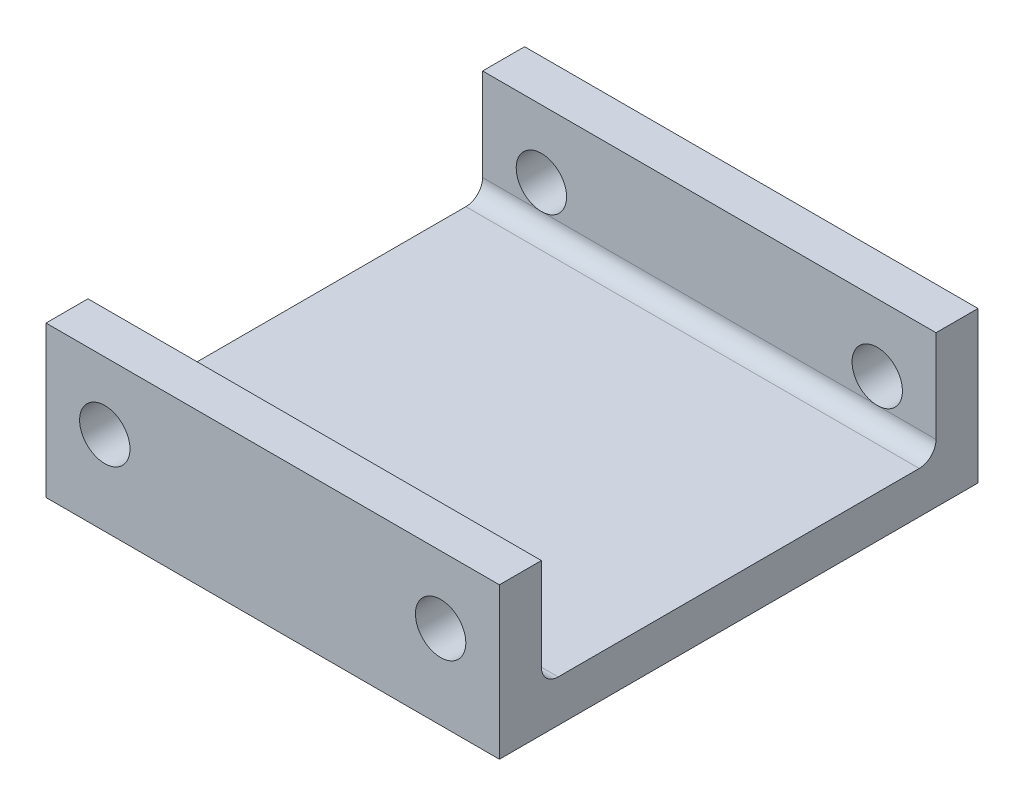
ISO-10303-21;
HEADER;
FILE_DESCRIPTION(('STEP AP214'),'2;1');
FILE_NAME('part.step','',(''),(''),'','','');
FILE_SCHEMA(('AUTOMOTIVE_DESIGN { 1 0 10303 214 1 1 1 1 }'));
ENDSEC;
DATA;
#1=APPLICATION_CONTEXT('core data for automotive mechanical design processes');
#2=APPLICATION_PROTOCOL_DEFINITION('international standard','automotive_design',2000,#1);
#3=PRODUCT_CONTEXT('',#1,'mechanical');
#4=PRODUCT('Part','Part','',(#3));
#5=PRODUCT_RELATED_PRODUCT_CATEGORY('part','',(#4));
#6=PRODUCT_DEFINITION_FORMATION('','',#4);
#7=PRODUCT_DEFINITION_CONTEXT('part definition',#1,'design');
#8=PRODUCT_DEFINITION('design','',#6,#7);
#9=PRODUCT_DEFINITION_SHAPE('','',#8);
#10=(LENGTH_UNIT() NAMED_UNIT(*) SI_UNIT(.MILLI.,.METRE.));
#11=(NAMED_UNIT(*) PLANE_ANGLE_UNIT() SI_UNIT($,.RADIAN.));
#12=(NAMED_UNIT(*) SI_UNIT($,.STERADIAN.) SOLID_ANGLE_UNIT());
#13=UNCERTAINTY_MEASURE_WITH_UNIT(LENGTH_MEASURE(1.E-05),#10,'distance_accuracy_value','');
#14=(GEOMETRIC_REPRESENTATION_CONTEXT(3) GLOBAL_UNCERTAINTY_ASSIGNED_CONTEXT((#13)) GLOBAL_UNIT_ASSIGNED_CONTEXT((#10,
#11,#12)) REPRESENTATION_CONTEXT('',''));
#15=CARTESIAN_POINT('',(0.,0.,0.));
#16=DIRECTION('',(0.,0.,1.));
#17=DIRECTION('',(1.,0.,0.));
#18=AXIS2_PLACEMENT_3D('',#15,#16,#17);
#19=CARTESIAN_POINT('',(-27.,0.,57.));
#20=DIRECTION('',(0.,-1.,0.));
#21=DIRECTION('',(0.,0.,-1.));
#22=AXIS2_PLACEMENT_3D('',#19,#20,#21);
#23=PLANE('',#22);
#24=DIRECTION('',(0.,0.,-1.));
#25=VECTOR('',#24,1.);
#26=CARTESIAN_POINT('',(-27.,0.,57.));
#27=LINE('',#26,#25);
#28=CARTESIAN_POINT('',(-27.,0.,5.));
#29=VERTEX_POINT('',#28);
#30=CARTESIAN_POINT('',(-27.,0.,0.));
#31=VERTEX_POINT('',#30);
#32=EDGE_CURVE('E150',#29,#31,#27,.T.);
#33=ORIENTED_EDGE('',*,*,#32,.F.);
#34=DIRECTION('',(-1.,0.,0.));
#35=VECTOR('',#34,1.);
#36=CARTESIAN_POINT('',(30.,0.,5.));
#37=LINE('',#36,#35);
#38=CARTESIAN_POINT('',(27.,0.,5.));
#39=VERTEX_POINT('',#38);
#40=EDGE_CURVE('E142',#39,#29,#37,.T.);
#41=ORIENTED_EDGE('',*,*,#40,.F.);
#42=DIRECTION('',(0.,0.,-1.));
#43=VECTOR('',#42,1.);
#44=CARTESIAN_POINT('',(27.,0.,57.));
#45=LINE('',#44,#43);
#46=CARTESIAN_POINT('',(27.,0.,0.));
#47=VERTEX_POINT('',#46);
#48=EDGE_CURVE('E149',#39,#47,#45,.T.);
#49=ORIENTED_EDGE('',*,*,#48,.T.);
#50=DIRECTION('',(-1.,0.,0.));
#51=VECTOR('',#50,1.);
#52=CARTESIAN_POINT('',(-27.,0.,0.));
#53=LINE('',#52,#51);
#54=EDGE_CURVE('E205',#47,#31,#53,.T.);
#55=ORIENTED_EDGE('',*,*,#54,.T.);
#56=EDGE_LOOP('',(#33,#41,#49,#55));
#57=FACE_BOUND('',#56,.T.);
#58=ADVANCED_FACE('F33',(#57),#23,.F.);
#59=CARTESIAN_POINT('',(-20.,-8.,57.));
#60=DIRECTION('',(0.,0.,-1.));
#61=DIRECTION('',(-1.,0.,0.));
#62=AXIS2_PLACEMENT_3D('',#59,#60,#61);
#63=CYLINDRICAL_SURFACE('',#62,2.99999999999999);
#64=CARTESIAN_POINT('',(-20.,-8.,5.));
#65=DIRECTION('',(0.,0.,-1.));
#66=DIRECTION('',(0.,1.,0.));
#67=AXIS2_PLACEMENT_3D('',#64,#65,#66);
#68=CIRCLE('',#67,2.99999999999999);
#69=CARTESIAN_POINT('',(-20.,-11.,5.));
#70=VERTEX_POINT('',#69);
#71=EDGE_CURVE('E373',#70,#70,#68,.T.);
#72=ORIENTED_EDGE('',*,*,#71,.F.);
#73=EDGE_LOOP('',(#72));
#74=FACE_BOUND('',#73,.T.);
#75=CARTESIAN_POINT('',(-20.,-8.,0.));
#76=DIRECTION('',(0.,0.,1.));
#77=DIRECTION('',(1.,0.,0.));
#78=AXIS2_PLACEMENT_3D('',#75,#76,#77);
#79=CIRCLE('',#78,2.99999999999999);
#80=CARTESIAN_POINT('',(-17.,-8.,0.));
#81=VERTEX_POINT('',#80);
#82=EDGE_CURVE('E176',#81,#81,#79,.T.);
#83=ORIENTED_EDGE('',*,*,#82,.F.);
#84=EDGE_LOOP('',(#83));
#85=FACE_BOUND('',#84,.T.);
#86=ADVANCED_FACE('F232',(#74,#85),#63,.F.);
#87=CARTESIAN_POINT('',(20.,-8.,57.));
#88=DIRECTION('',(0.,0.,-1.));
#89=DIRECTION('',(-1.,0.,0.));
#90=AXIS2_PLACEMENT_3D('',#87,#88,#89);
#91=CYLINDRICAL_SURFACE('',#90,2.99999999999999);
#92=CARTESIAN_POINT('',(20.,-8.,5.));
#93=DIRECTION('',(0.,0.,-1.));
#94=DIRECTION('',(0.,1.,0.));
#95=AXIS2_PLACEMENT_3D('',#92,#93,#94);
#96=CIRCLE('',#95,2.99999999999999);
#97=CARTESIAN_POINT('',(20.,-11.,5.));
#98=VERTEX_POINT('',#97);
#99=EDGE_CURVE('E11',#98,#98,#96,.T.);
#100=ORIENTED_EDGE('',*,*,#99,.F.);
#101=EDGE_LOOP('',(#100));
#102=FACE_BOUND('',#101,.T.);
#103=CARTESIAN_POINT('',(20.,-8.,0.));
#104=DIRECTION('',(0.,0.,1.));
#105=DIRECTION('',(1.,0.,0.));
#106=AXIS2_PLACEMENT_3D('',#103,#104,#105);
#107=CIRCLE('',#106,2.99999999999999);
#108=CARTESIAN_POINT('',(23.,-8.,0.));
#109=VERTEX_POINT('',#108);
#110=EDGE_CURVE('E177',#109,#109,#107,.T.);
#111=ORIENTED_EDGE('',*,*,#110,.F.);
#112=EDGE_LOOP('',(#111));
#113=FACE_BOUND('',#112,.T.);
#114=ADVANCED_FACE('F171',(#102,#113),#91,.F.);
#115=CARTESIAN_POINT('',(0.,0.,57.));
#116=DIRECTION('',(0.,0.,-1.));
#117=DIRECTION('',(-1.,0.,0.));
#118=AXIS2_PLACEMENT_3D('',#115,#116,#117);
#119=PLANE('',#118);
#120=DIRECTION('',(1.,0.,0.));
#121=VECTOR('',#120,1.);
#122=CARTESIAN_POINT('',(-27.,-18.,57.));
#123=LINE('',#122,#121);
#124=CARTESIAN_POINT('',(-27.,-18.,57.));
#125=VERTEX_POINT('',#124);
#126=CARTESIAN_POINT('',(27.,-18.,57.));
#127=VERTEX_POINT('',#126);
#128=EDGE_CURVE('E191',#125,#127,#123,.T.);
#129=ORIENTED_EDGE('',*,*,#128,.T.);
#130=DIRECTION('',(0.,1.,0.));
#131=VECTOR('',#130,1.);
#132=CARTESIAN_POINT('',(27.,0.,57.));
#133=LINE('',#132,#131);
#134=CARTESIAN_POINT('',(27.,0.,57.));
#135=VERTEX_POINT('',#134);
#136=EDGE_CURVE('E194',#127,#135,#133,.T.);
#137=ORIENTED_EDGE('',*,*,#136,.T.);
#138=DIRECTION('',(-1.,0.,0.));
#139=VECTOR('',#138,1.);
#140=CARTESIAN_POINT('',(-27.,0.,57.));
#141=LINE('',#140,#139);
#142=CARTESIAN_POINT('',(-27.,0.,57.));
#143=VERTEX_POINT('',#142);
#144=EDGE_CURVE('E197',#135,#143,#141,.T.);
#145=ORIENTED_EDGE('',*,*,#144,.T.);
#146=DIRECTION('',(0.,-1.,0.));
#147=VECTOR('',#146,1.);
#148=CARTESIAN_POINT('',(-27.,0.,57.));
#149=LINE('',#148,#147);
#150=EDGE_CURVE('E148',#143,#125,#149,.T.);
#151=ORIENTED_EDGE('',*,*,#150,.T.);
#152=EDGE_LOOP('',(#129,#137,#145,#151));
#153=FACE_BOUND('',#152,.T.);
#154=CARTESIAN_POINT('',(-20.,-8.,57.));
#155=DIRECTION('',(0.,0.,1.));
#156=DIRECTION('',(1.,0.,0.));
#157=AXIS2_PLACEMENT_3D('',#154,#155,#156);
#158=CIRCLE('',#157,2.99999999999999);
#159=CARTESIAN_POINT('',(-17.,-8.,57.));
#160=VERTEX_POINT('',#159);
#161=EDGE_CURVE('E180',#160,#160,#158,.T.);
#162=ORIENTED_EDGE('',*,*,#161,.F.);
#163=EDGE_LOOP('',(#162));
#164=FACE_BOUND('',#163,.T.);
#165=CARTESIAN_POINT('',(20.,-8.,57.));
#166=DIRECTION('',(0.,0.,1.));
#167=DIRECTION('',(1.,0.,0.));
#168=AXIS2_PLACEMENT_3D('',#165,#166,#167);
#169=CIRCLE('',#168,2.99999999999999);
#170=CARTESIAN_POINT('',(23.,-8.,57.));
#171=VERTEX_POINT('',#170);
#172=EDGE_CURVE('E174',#171,#171,#169,.T.);
#173=ORIENTED_EDGE('',*,*,#172,.F.);
#174=EDGE_LOOP('',(#173));
#175=FACE_BOUND('',#174,.T.);
#176=ADVANCED_FACE('F223',(#153,#164,#175),#119,.F.);
#177=CARTESIAN_POINT('',(0.,0.,0.));
#178=DIRECTION('',(0.,0.,-1.));
#179=DIRECTION('',(-1.,0.,0.));
#180=AXIS2_PLACEMENT_3D('',#177,#178,#179);
#181=PLANE('',#180);
#182=ORIENTED_EDGE('',*,*,#82,.T.);
#183=EDGE_LOOP('',(#182));
#184=FACE_BOUND('',#183,.T.);
#185=DIRECTION('',(1.,0.,0.));
#186=VECTOR('',#185,1.);
#187=CARTESIAN_POINT('',(-27.,-18.,0.));
#188=LINE('',#187,#186);
#189=CARTESIAN_POINT('',(-27.,-18.,0.));
#190=VERTEX_POINT('',#189);
#191=CARTESIAN_POINT('',(27.,-18.,0.));
#192=VERTEX_POINT('',#191);
#193=EDGE_CURVE('E189',#190,#192,#188,.T.);
#194=ORIENTED_EDGE('',*,*,#193,.F.);
#195=DIRECTION('',(0.,-1.,0.));
#196=VECTOR('',#195,1.);
#197=CARTESIAN_POINT('',(-27.,0.,0.));
#198=LINE('',#197,#196);
#199=EDGE_CURVE('E195',#31,#190,#198,.T.);
#200=ORIENTED_EDGE('',*,*,#199,.F.);
#201=ORIENTED_EDGE('',*,*,#54,.F.);
#202=DIRECTION('',(0.,1.,0.));
#203=VECTOR('',#202,1.);
#204=CARTESIAN_POINT('',(27.,0.,0.));
#205=LINE('',#204,#203);
#206=EDGE_CURVE('E202',#192,#47,#205,.T.);
#207=ORIENTED_EDGE('',*,*,#206,.F.);
#208=EDGE_LOOP('',(#194,#200,#201,#207));
#209=FACE_BOUND('',#208,.T.);
#210=ORIENTED_EDGE('',*,*,#110,.T.);
#211=EDGE_LOOP('',(#210));
#212=FACE_BOUND('',#211,.T.);
#213=ADVANCED_FACE('F217',(#184,#209,#212),#181,.T.);
#214=CARTESIAN_POINT('',(-27.,-18.,57.));
#215=DIRECTION('',(0.,1.,0.));
#216=DIRECTION('',(0.,0.,1.));
#217=AXIS2_PLACEMENT_3D('',#214,#215,#216);
#218=PLANE('',#217);
#219=ORIENTED_EDGE('',*,*,#193,.T.);
#220=DIRECTION('',(0.,0.,-1.));
#221=VECTOR('',#220,1.);
#222=CARTESIAN_POINT('',(27.,-18.,57.));
#223=LINE('',#222,#221);
#224=EDGE_CURVE('E157',#127,#192,#223,.T.);
#225=ORIENTED_EDGE('',*,*,#224,.F.);
#226=ORIENTED_EDGE('',*,*,#128,.F.);
#227=DIRECTION('',(0.,0.,-1.));
#228=VECTOR('',#227,1.);
#229=CARTESIAN_POINT('',(-27.,-18.,57.));
#230=LINE('',#229,#228);
#231=EDGE_CURVE('E153',#125,#190,#230,.T.);
#232=ORIENTED_EDGE('',*,*,#231,.T.);
#233=EDGE_LOOP('',(#219,#225,#226,#232));
#234=FACE_BOUND('',#233,.T.);
#235=ADVANCED_FACE('F35',(#234),#218,.F.);
#236=CARTESIAN_POINT('',(27.,0.,57.));
#237=DIRECTION('',(-1.,0.,0.));
#238=DIRECTION('',(0.,0.,1.));
#239=AXIS2_PLACEMENT_3D('',#236,#237,#238);
#240=PLANE('',#239);
#241=ORIENTED_EDGE('',*,*,#48,.F.);
#242=DIRECTION('',(0.,-1.,0.));
#243=VECTOR('',#242,1.);
#244=CARTESIAN_POINT('',(27.,0.,5.));
#245=LINE('',#244,#243);
#246=CARTESIAN_POINT('',(27.,-11.,5.));
#247=VERTEX_POINT('',#246);
#248=EDGE_CURVE('E363',#39,#247,#245,.T.);
#249=ORIENTED_EDGE('',*,*,#248,.T.);
#250=CARTESIAN_POINT('',(27.,-11.,7.));
#251=DIRECTION('',(-1.,0.,0.));
#252=DIRECTION('',(0.,0.,1.));
#253=AXIS2_PLACEMENT_3D('',#250,#251,#252);
#254=CIRCLE('',#253,2.);
#255=CARTESIAN_POINT('',(27.,-13.,7.00000000000001));
#256=VERTEX_POINT('',#255);
#257=EDGE_CURVE('E372',#247,#256,#254,.T.);
#258=ORIENTED_EDGE('',*,*,#257,.T.);
#259=DIRECTION('',(0.,0.,1.));
#260=VECTOR('',#259,1.);
#261=CARTESIAN_POINT('',(27.,-13.,57.));
#262=LINE('',#261,#260);
#263=CARTESIAN_POINT('',(27.,-13.,50.));
#264=VERTEX_POINT('',#263);
#265=EDGE_CURVE('E183',#256,#264,#262,.T.);
#266=ORIENTED_EDGE('',*,*,#265,.T.);
#267=CARTESIAN_POINT('',(27.,-11.,50.));
#268=DIRECTION('',(-1.,0.,0.));
#269=DIRECTION('',(0.,0.,1.));
#270=AXIS2_PLACEMENT_3D('',#267,#268,#269);
#271=CIRCLE('',#270,2.);
#272=CARTESIAN_POINT('',(27.,-11.,52.));
#273=VERTEX_POINT('',#272);
#274=EDGE_CURVE('E375',#264,#273,#271,.T.);
#275=ORIENTED_EDGE('',*,*,#274,.T.);
#276=DIRECTION('',(0.,1.,0.));
#277=VECTOR('',#276,1.);
#278=CARTESIAN_POINT('',(27.,0.,52.));
#279=LINE('',#278,#277);
#280=CARTESIAN_POINT('',(27.,0.,52.));
#281=VERTEX_POINT('',#280);
#282=EDGE_CURVE('E378',#273,#281,#279,.T.);
#283=ORIENTED_EDGE('',*,*,#282,.T.);
#284=EDGE_CURVE('E141',#135,#281,#45,.T.);
#285=ORIENTED_EDGE('',*,*,#284,.F.);
#286=ORIENTED_EDGE('',*,*,#136,.F.);
#287=ORIENTED_EDGE('',*,*,#224,.T.);
#288=ORIENTED_EDGE('',*,*,#206,.T.);
#289=EDGE_LOOP('',(#241,#249,#258,#266,#275,#283,#285,#286,#287,#288));
#290=FACE_BOUND('',#289,.T.);
#291=ADVANCED_FACE('F221',(#290),#240,.F.);
#292=ORIENTED_EDGE('',*,*,#284,.T.);
#293=DIRECTION('',(-1.,0.,0.));
#294=VECTOR('',#293,1.);
#295=CARTESIAN_POINT('',(30.,0.,52.));
#296=LINE('',#295,#294);
#297=CARTESIAN_POINT('',(-27.,0.,52.));
#298=VERTEX_POINT('',#297);
#299=EDGE_CURVE('E125',#281,#298,#296,.T.);
#300=ORIENTED_EDGE('',*,*,#299,.T.);
#301=EDGE_CURVE('E138',#143,#298,#27,.T.);
#302=ORIENTED_EDGE('',*,*,#301,.F.);
#303=ORIENTED_EDGE('',*,*,#144,.F.);
#304=EDGE_LOOP('',(#292,#300,#302,#303));
#305=FACE_BOUND('',#304,.T.);
#306=ADVANCED_FACE('F136',(#305),#23,.F.);
#307=CARTESIAN_POINT('',(-27.,0.,57.));
#308=DIRECTION('',(1.,0.,0.));
#309=DIRECTION('',(0.,1.,0.));
#310=AXIS2_PLACEMENT_3D('',#307,#308,#309);
#311=PLANE('',#310);
#312=CARTESIAN_POINT('',(-27.,-11.,7.));
#313=DIRECTION('',(-1.,0.,0.));
#314=DIRECTION('',(0.,-1.,0.));
#315=AXIS2_PLACEMENT_3D('',#312,#313,#314);
#316=CIRCLE('',#315,2.);
#317=CARTESIAN_POINT('',(-27.,-11.,5.));
#318=VERTEX_POINT('',#317);
#319=CARTESIAN_POINT('',(-27.,-13.,7.00000000000001));
#320=VERTEX_POINT('',#319);
#321=EDGE_CURVE('E368',#318,#320,#316,.T.);
#322=ORIENTED_EDGE('',*,*,#321,.F.);
#323=DIRECTION('',(0.,-1.,0.));
#324=VECTOR('',#323,1.);
#325=CARTESIAN_POINT('',(-27.,0.,5.));
#326=LINE('',#325,#324);
#327=EDGE_CURVE('E131',#29,#318,#326,.T.);
#328=ORIENTED_EDGE('',*,*,#327,.F.);
#329=ORIENTED_EDGE('',*,*,#32,.T.);
#330=ORIENTED_EDGE('',*,*,#199,.T.);
#331=ORIENTED_EDGE('',*,*,#231,.F.);
#332=ORIENTED_EDGE('',*,*,#150,.F.);
#333=ORIENTED_EDGE('',*,*,#301,.T.);
#334=DIRECTION('',(0.,1.,0.));
#335=VECTOR('',#334,1.);
#336=CARTESIAN_POINT('',(-27.,-11.,52.));
#337=LINE('',#336,#335);
#338=CARTESIAN_POINT('',(-27.,-11.,52.));
#339=VERTEX_POINT('',#338);
#340=EDGE_CURVE('E122',#339,#298,#337,.T.);
#341=ORIENTED_EDGE('',*,*,#340,.F.);
#342=CARTESIAN_POINT('',(-27.,-11.,50.));
#343=DIRECTION('',(-1.,0.,0.));
#344=DIRECTION('',(0.,-1.,0.));
#345=AXIS2_PLACEMENT_3D('',#342,#343,#344);
#346=CIRCLE('',#345,2.);
#347=CARTESIAN_POINT('',(-27.,-13.,50.));
#348=VERTEX_POINT('',#347);
#349=EDGE_CURVE('E48',#348,#339,#346,.T.);
#350=ORIENTED_EDGE('',*,*,#349,.F.);
#351=DIRECTION('',(0.,0.,1.));
#352=VECTOR('',#351,1.);
#353=CARTESIAN_POINT('',(-27.,-13.,7.00000000000001));
#354=LINE('',#353,#352);
#355=EDGE_CURVE('E395',#320,#348,#354,.T.);
#356=ORIENTED_EDGE('',*,*,#355,.F.);
#357=EDGE_LOOP('',(#322,#328,#329,#330,#331,#332,#333,#341,#350,#356));
#358=FACE_BOUND('',#357,.T.);
#359=ADVANCED_FACE('F146',(#358),#311,.F.);
#360=CARTESIAN_POINT('',(-20.,-8.,52.));
#361=DIRECTION('',(0.,0.,1.));
#362=DIRECTION('',(1.,0.,0.));
#363=AXIS2_PLACEMENT_3D('',#360,#361,#362);
#364=CIRCLE('',#363,2.99999999999999);
#365=CARTESIAN_POINT('',(-20.,-11.,52.));
#366=VERTEX_POINT('',#365);
#367=EDGE_CURVE('E389',#366,#366,#364,.T.);
#368=ORIENTED_EDGE('',*,*,#367,.F.);
#369=EDGE_LOOP('',(#368));
#370=FACE_BOUND('',#369,.T.);
#371=ORIENTED_EDGE('',*,*,#161,.T.);
#372=EDGE_LOOP('',(#371));
#373=FACE_BOUND('',#372,.T.);
#374=ADVANCED_FACE('F169',(#370,#373),#63,.F.);
#375=CARTESIAN_POINT('',(20.,-8.,52.));
#376=DIRECTION('',(0.,0.,1.));
#377=DIRECTION('',(1.,0.,0.));
#378=AXIS2_PLACEMENT_3D('',#375,#376,#377);
#379=CIRCLE('',#378,2.99999999999999);
#380=CARTESIAN_POINT('',(20.,-11.,52.));
#381=VERTEX_POINT('',#380);
#382=EDGE_CURVE('E41',#381,#381,#379,.T.);
#383=ORIENTED_EDGE('',*,*,#382,.F.);
#384=EDGE_LOOP('',(#383));
#385=FACE_BOUND('',#384,.T.);
#386=ORIENTED_EDGE('',*,*,#172,.T.);
#387=EDGE_LOOP('',(#386));
#388=FACE_BOUND('',#387,.T.);
#389=ADVANCED_FACE('F165',(#385,#388),#91,.F.);
#390=CARTESIAN_POINT('',(30.,-13.,7.00000000000001));
#391=DIRECTION('',(0.,-1.,0.));
#392=DIRECTION('',(1.,0.,0.));
#393=AXIS2_PLACEMENT_3D('',#390,#391,#392);
#394=PLANE('',#393);
#395=DIRECTION('',(-1.,0.,0.));
#396=VECTOR('',#395,1.);
#397=CARTESIAN_POINT('',(30.,-13.,7.00000000000001));
#398=LINE('',#397,#396);
#399=EDGE_CURVE('E385',#256,#320,#398,.T.);
#400=ORIENTED_EDGE('',*,*,#399,.T.);
#401=ORIENTED_EDGE('',*,*,#355,.T.);
#402=DIRECTION('',(-1.,0.,0.));
#403=VECTOR('',#402,1.);
#404=CARTESIAN_POINT('',(30.,-13.,50.));
#405=LINE('',#404,#403);
#406=EDGE_CURVE('E386',#264,#348,#405,.T.);
#407=ORIENTED_EDGE('',*,*,#406,.F.);
#408=ORIENTED_EDGE('',*,*,#265,.F.);
#409=EDGE_LOOP('',(#400,#401,#407,#408));
#410=FACE_BOUND('',#409,.T.);
#411=ADVANCED_FACE('F168',(#410),#394,.F.);
#412=CARTESIAN_POINT('',(30.,-11.,50.));
#413=DIRECTION('',(-1.,0.,0.));
#414=DIRECTION('',(0.,-1.,0.));
#415=AXIS2_PLACEMENT_3D('',#412,#413,#414);
#416=CYLINDRICAL_SURFACE('',#415,2.);
#417=ORIENTED_EDGE('',*,*,#406,.T.);
#418=ORIENTED_EDGE('',*,*,#349,.T.);
#419=DIRECTION('',(-1.,0.,0.));
#420=VECTOR('',#419,1.);
#421=CARTESIAN_POINT('',(30.,-11.,52.));
#422=LINE('',#421,#420);
#423=EDGE_CURVE('E128',#366,#339,#422,.T.);
#424=ORIENTED_EDGE('',*,*,#423,.F.);
#425=EDGE_CURVE('E162',#381,#366,#422,.T.);
#426=ORIENTED_EDGE('',*,*,#425,.F.);
#427=EDGE_CURVE('E143',#273,#381,#422,.T.);
#428=ORIENTED_EDGE('',*,*,#427,.F.);
#429=ORIENTED_EDGE('',*,*,#274,.F.);
#430=EDGE_LOOP('',(#417,#418,#424,#426,#428,#429));
#431=FACE_BOUND('',#430,.T.);
#432=ADVANCED_FACE('F319',(#431),#416,.F.);
#433=CARTESIAN_POINT('',(30.,-11.,7.));
#434=DIRECTION('',(-1.,0.,0.));
#435=DIRECTION('',(0.,-1.,0.));
#436=AXIS2_PLACEMENT_3D('',#433,#434,#435);
#437=CYLINDRICAL_SURFACE('',#436,2.);
#438=DIRECTION('',(-1.,0.,0.));
#439=VECTOR('',#438,1.);
#440=CARTESIAN_POINT('',(30.,-11.,5.));
#441=LINE('',#440,#439);
#442=EDGE_CURVE('E387',#247,#98,#441,.T.);
#443=ORIENTED_EDGE('',*,*,#442,.T.);
#444=EDGE_CURVE('E56',#98,#70,#441,.T.);
#445=ORIENTED_EDGE('',*,*,#444,.T.);
#446=EDGE_CURVE('E364',#70,#318,#441,.T.);
#447=ORIENTED_EDGE('',*,*,#446,.T.);
#448=ORIENTED_EDGE('',*,*,#321,.T.);
#449=ORIENTED_EDGE('',*,*,#399,.F.);
#450=ORIENTED_EDGE('',*,*,#257,.F.);
#451=EDGE_LOOP('',(#443,#445,#447,#448,#449,#450));
#452=FACE_BOUND('',#451,.T.);
#453=ADVANCED_FACE('F329',(#452),#437,.F.);
#454=CARTESIAN_POINT('',(30.,0.,5.));
#455=DIRECTION('',(0.,0.,-1.));
#456=DIRECTION('',(0.,1.,0.));
#457=AXIS2_PLACEMENT_3D('',#454,#455,#456);
#458=PLANE('',#457);
#459=ORIENTED_EDGE('',*,*,#40,.T.);
#460=ORIENTED_EDGE('',*,*,#327,.T.);
#461=ORIENTED_EDGE('',*,*,#446,.F.);
#462=ORIENTED_EDGE('',*,*,#71,.T.);
#463=ORIENTED_EDGE('',*,*,#444,.F.);
#464=ORIENTED_EDGE('',*,*,#99,.T.);
#465=ORIENTED_EDGE('',*,*,#442,.F.);
#466=ORIENTED_EDGE('',*,*,#248,.F.);
#467=EDGE_LOOP('',(#459,#460,#461,#462,#463,#464,#465,#466));
#468=FACE_BOUND('',#467,.T.);
#469=ADVANCED_FACE('F338',(#468),#458,.F.);
#470=CARTESIAN_POINT('',(30.,-11.,52.));
#471=DIRECTION('',(0.,0.,1.));
#472=DIRECTION('',(1.,0.,0.));
#473=AXIS2_PLACEMENT_3D('',#470,#471,#472);
#474=PLANE('',#473);
#475=ORIENTED_EDGE('',*,*,#427,.T.);
#476=ORIENTED_EDGE('',*,*,#382,.T.);
#477=ORIENTED_EDGE('',*,*,#425,.T.);
#478=ORIENTED_EDGE('',*,*,#367,.T.);
#479=ORIENTED_EDGE('',*,*,#423,.T.);
#480=ORIENTED_EDGE('',*,*,#340,.T.);
#481=ORIENTED_EDGE('',*,*,#299,.F.);
#482=ORIENTED_EDGE('',*,*,#282,.F.);
#483=EDGE_LOOP('',(#475,#476,#477,#478,#479,#480,#481,#482));
#484=FACE_BOUND('',#483,.T.);
#485=ADVANCED_FACE('F124',(#484),#474,.F.);
#486=CLOSED_SHELL('',(#58,#86,#114,#176,#213,#235,#291,#306,#359,#374,#389,#411,#432,#453,#469,#485));
#487=MANIFOLD_SOLID_BREP('B2',#486);
#488=ADVANCED_BREP_SHAPE_REPRESENTATION('',(#18,#487),#14);
#489=SHAPE_DEFINITION_REPRESENTATION(#9,#488);
ENDSEC;
END-ISO-10303-21;
